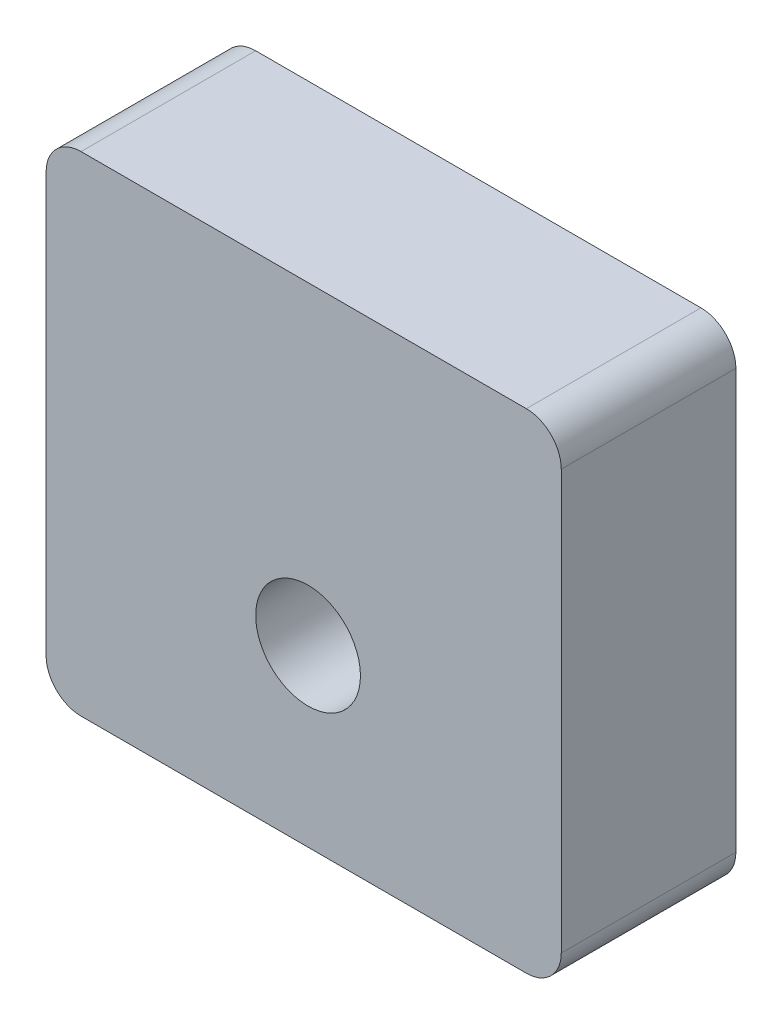
ISO-10303-21;
HEADER;
FILE_DESCRIPTION(('STEP AP214'),'2;1');
FILE_NAME('part.step','',(''),(''),'','','');
FILE_SCHEMA(('AUTOMOTIVE_DESIGN { 1 0 10303 214 1 1 1 1 }'));
ENDSEC;
DATA;
#1=APPLICATION_CONTEXT('core data for automotive mechanical design processes');
#2=APPLICATION_PROTOCOL_DEFINITION('international standard','automotive_design',2000,#1);
#3=PRODUCT_CONTEXT('',#1,'mechanical');
#4=PRODUCT('Part','Part','',(#3));
#5=PRODUCT_RELATED_PRODUCT_CATEGORY('part','',(#4));
#6=PRODUCT_DEFINITION_FORMATION('','',#4);
#7=PRODUCT_DEFINITION_CONTEXT('part definition',#1,'design');
#8=PRODUCT_DEFINITION('design','',#6,#7);
#9=PRODUCT_DEFINITION_SHAPE('','',#8);
#10=(LENGTH_UNIT() NAMED_UNIT(*) SI_UNIT(.MILLI.,.METRE.));
#11=(NAMED_UNIT(*) PLANE_ANGLE_UNIT() SI_UNIT($,.RADIAN.));
#12=(NAMED_UNIT(*) SI_UNIT($,.STERADIAN.) SOLID_ANGLE_UNIT());
#13=UNCERTAINTY_MEASURE_WITH_UNIT(LENGTH_MEASURE(1.E-05),#10,'distance_accuracy_value','');
#14=(GEOMETRIC_REPRESENTATION_CONTEXT(3) GLOBAL_UNCERTAINTY_ASSIGNED_CONTEXT((#13)) GLOBAL_UNIT_ASSIGNED_CONTEXT((#10,
#11,#12)) REPRESENTATION_CONTEXT('',''));
#15=CARTESIAN_POINT('',(0.,0.,0.));
#16=DIRECTION('',(0.,0.,1.));
#17=DIRECTION('',(1.,0.,0.));
#18=AXIS2_PLACEMENT_3D('',#15,#16,#17);
#19=CARTESIAN_POINT('',(-0.25,4.,0.));
#20=DIRECTION('',(0.,0.,1.));
#21=DIRECTION('',(1.,0.,0.));
#22=AXIS2_PLACEMENT_3D('',#19,#20,#21);
#23=PLANE('',#22);
#24=CARTESIAN_POINT('',(0.,0.,0.));
#25=DIRECTION('',(0.,0.,1.));
#26=DIRECTION('',(1.,0.,0.));
#27=AXIS2_PLACEMENT_3D('',#24,#25,#26);
#28=CIRCLE('',#27,3.);
#29=CARTESIAN_POINT('',(3.,0.,0.));
#30=VERTEX_POINT('',#29);
#31=EDGE_CURVE('E129',#30,#30,#28,.T.);
#32=ORIENTED_EDGE('',*,*,#31,.T.);
#33=EDGE_LOOP('',(#32));
#34=FACE_BOUND('',#33,.T.);
#35=DIRECTION('',(0.,1.,0.));
#36=VECTOR('',#35,1.);
#37=CARTESIAN_POINT('',(14.5,16.,0.));
#38=LINE('',#37,#36);
#39=CARTESIAN_POINT('',(14.5,-8.,0.));
#40=VERTEX_POINT('',#39);
#41=CARTESIAN_POINT('',(14.5,16.,0.));
#42=VERTEX_POINT('',#41);
#43=EDGE_CURVE('E78',#40,#42,#38,.T.);
#44=ORIENTED_EDGE('',*,*,#43,.F.);
#45=CARTESIAN_POINT('',(12.5,-8.,0.));
#46=DIRECTION('',(0.,0.,1.));
#47=DIRECTION('',(1.,0.,0.));
#48=AXIS2_PLACEMENT_3D('',#45,#46,#47);
#49=CIRCLE('',#48,2.);
#50=CARTESIAN_POINT('',(12.5,-10.,0.));
#51=VERTEX_POINT('',#50);
#52=EDGE_CURVE('E133',#51,#40,#49,.T.);
#53=ORIENTED_EDGE('',*,*,#52,.F.);
#54=DIRECTION('',(1.,0.,0.));
#55=VECTOR('',#54,1.);
#56=CARTESIAN_POINT('',(12.5,-10.,0.));
#57=LINE('',#56,#55);
#58=CARTESIAN_POINT('',(-13.,-10.,0.));
#59=VERTEX_POINT('',#58);
#60=EDGE_CURVE('E109',#59,#51,#57,.T.);
#61=ORIENTED_EDGE('',*,*,#60,.F.);
#62=CARTESIAN_POINT('',(-13.,-8.,0.));
#63=DIRECTION('',(0.,0.,1.));
#64=DIRECTION('',(1.,0.,0.));
#65=AXIS2_PLACEMENT_3D('',#62,#63,#64);
#66=CIRCLE('',#65,2.);
#67=CARTESIAN_POINT('',(-15.,-8.,0.));
#68=VERTEX_POINT('',#67);
#69=EDGE_CURVE('E136',#68,#59,#66,.T.);
#70=ORIENTED_EDGE('',*,*,#69,.F.);
#71=DIRECTION('',(0.,1.,0.));
#72=VECTOR('',#71,1.);
#73=CARTESIAN_POINT('',(-15.,-8.,0.));
#74=LINE('',#73,#72);
#75=CARTESIAN_POINT('',(-15.,16.,0.));
#76=VERTEX_POINT('',#75);
#77=EDGE_CURVE('E112',#76,#68,#74,.F.);
#78=ORIENTED_EDGE('',*,*,#77,.F.);
#79=CARTESIAN_POINT('',(-13.,16.,0.));
#80=DIRECTION('',(0.,0.,1.));
#81=DIRECTION('',(1.,0.,0.));
#82=AXIS2_PLACEMENT_3D('',#79,#80,#81);
#83=CIRCLE('',#82,2.);
#84=CARTESIAN_POINT('',(-13.,18.,0.));
#85=VERTEX_POINT('',#84);
#86=EDGE_CURVE('E94',#85,#76,#83,.T.);
#87=ORIENTED_EDGE('',*,*,#86,.F.);
#88=DIRECTION('',(1.,0.,0.));
#89=VECTOR('',#88,1.);
#90=CARTESIAN_POINT('',(-13.,18.,0.));
#91=LINE('',#90,#89);
#92=CARTESIAN_POINT('',(12.5,18.,0.));
#93=VERTEX_POINT('',#92);
#94=EDGE_CURVE('E92',#93,#85,#91,.F.);
#95=ORIENTED_EDGE('',*,*,#94,.F.);
#96=CARTESIAN_POINT('',(12.5,16.,0.));
#97=DIRECTION('',(0.,0.,1.));
#98=DIRECTION('',(1.,0.,0.));
#99=AXIS2_PLACEMENT_3D('',#96,#97,#98);
#100=CIRCLE('',#99,2.);
#101=EDGE_CURVE('E20',#42,#93,#100,.T.);
#102=ORIENTED_EDGE('',*,*,#101,.F.);
#103=EDGE_LOOP('',(#44,#53,#61,#70,#78,#87,#95,#102));
#104=FACE_BOUND('',#103,.T.);
#105=ADVANCED_FACE('F17',(#34,#104),#23,.F.);
#106=CARTESIAN_POINT('',(14.5,16.,0.));
#107=DIRECTION('',(1.,0.,0.));
#108=DIRECTION('',(0.,0.,-1.));
#109=AXIS2_PLACEMENT_3D('',#106,#107,#108);
#110=PLANE('',#109);
#111=ORIENTED_EDGE('',*,*,#43,.T.);
#112=DIRECTION('',(0.,0.,1.));
#113=VECTOR('',#112,1.);
#114=CARTESIAN_POINT('',(14.5,16.,0.));
#115=LINE('',#114,#113);
#116=CARTESIAN_POINT('',(14.5,16.,10.));
#117=VERTEX_POINT('',#116);
#118=EDGE_CURVE('E89',#117,#42,#115,.F.);
#119=ORIENTED_EDGE('',*,*,#118,.F.);
#120=DIRECTION('',(0.,1.,0.));
#121=VECTOR('',#120,1.);
#122=CARTESIAN_POINT('',(14.5,4.,10.));
#123=LINE('',#122,#121);
#124=CARTESIAN_POINT('',(14.5,-8.,10.));
#125=VERTEX_POINT('',#124);
#126=EDGE_CURVE('E128',#125,#117,#123,.T.);
#127=ORIENTED_EDGE('',*,*,#126,.F.);
#128=DIRECTION('',(0.,0.,1.));
#129=VECTOR('',#128,1.);
#130=CARTESIAN_POINT('',(14.5,-8.,0.));
#131=LINE('',#130,#129);
#132=EDGE_CURVE('E132',#40,#125,#131,.T.);
#133=ORIENTED_EDGE('',*,*,#132,.F.);
#134=EDGE_LOOP('',(#111,#119,#127,#133));
#135=FACE_BOUND('',#134,.T.);
#136=ADVANCED_FACE('F169',(#135),#110,.T.);
#137=CARTESIAN_POINT('',(12.5,16.,0.));
#138=DIRECTION('',(0.,0.,1.));
#139=DIRECTION('',(1.,0.,0.));
#140=AXIS2_PLACEMENT_3D('',#137,#138,#139);
#141=CYLINDRICAL_SURFACE('',#140,2.);
#142=ORIENTED_EDGE('',*,*,#101,.T.);
#143=DIRECTION('',(0.,0.,1.));
#144=VECTOR('',#143,1.);
#145=CARTESIAN_POINT('',(12.5,18.,0.));
#146=LINE('',#145,#144);
#147=CARTESIAN_POINT('',(12.5,18.,10.));
#148=VERTEX_POINT('',#147);
#149=EDGE_CURVE('E87',#148,#93,#146,.F.);
#150=ORIENTED_EDGE('',*,*,#149,.F.);
#151=CARTESIAN_POINT('',(12.5,16.,10.));
#152=DIRECTION('',(0.,0.,1.));
#153=DIRECTION('',(1.,0.,0.));
#154=AXIS2_PLACEMENT_3D('',#151,#152,#153);
#155=CIRCLE('',#154,2.);
#156=EDGE_CURVE('E126',#117,#148,#155,.T.);
#157=ORIENTED_EDGE('',*,*,#156,.F.);
#158=ORIENTED_EDGE('',*,*,#118,.T.);
#159=EDGE_LOOP('',(#142,#150,#157,#158));
#160=FACE_BOUND('',#159,.T.);
#161=ADVANCED_FACE('F84',(#160),#141,.T.);
#162=CARTESIAN_POINT('',(-13.,18.,0.));
#163=DIRECTION('',(0.,1.,0.));
#164=DIRECTION('',(0.,0.,1.));
#165=AXIS2_PLACEMENT_3D('',#162,#163,#164);
#166=PLANE('',#165);
#167=ORIENTED_EDGE('',*,*,#94,.T.);
#168=DIRECTION('',(0.,0.,1.));
#169=VECTOR('',#168,1.);
#170=CARTESIAN_POINT('',(-13.,18.,0.));
#171=LINE('',#170,#169);
#172=CARTESIAN_POINT('',(-13.,18.,10.));
#173=VERTEX_POINT('',#172);
#174=EDGE_CURVE('E97',#173,#85,#171,.F.);
#175=ORIENTED_EDGE('',*,*,#174,.F.);
#176=DIRECTION('',(1.,0.,0.));
#177=VECTOR('',#176,1.);
#178=CARTESIAN_POINT('',(-0.25,18.,10.));
#179=LINE('',#178,#177);
#180=EDGE_CURVE('E101',#148,#173,#179,.F.);
#181=ORIENTED_EDGE('',*,*,#180,.F.);
#182=ORIENTED_EDGE('',*,*,#149,.T.);
#183=EDGE_LOOP('',(#167,#175,#181,#182));
#184=FACE_BOUND('',#183,.T.);
#185=ADVANCED_FACE('F99',(#184),#166,.T.);
#186=CARTESIAN_POINT('',(-13.,16.,0.));
#187=DIRECTION('',(0.,0.,1.));
#188=DIRECTION('',(1.,0.,0.));
#189=AXIS2_PLACEMENT_3D('',#186,#187,#188);
#190=CYLINDRICAL_SURFACE('',#189,2.);
#191=ORIENTED_EDGE('',*,*,#86,.T.);
#192=DIRECTION('',(0.,0.,1.));
#193=VECTOR('',#192,1.);
#194=CARTESIAN_POINT('',(-15.,16.,0.));
#195=LINE('',#194,#193);
#196=CARTESIAN_POINT('',(-15.,16.,10.));
#197=VERTEX_POINT('',#196);
#198=EDGE_CURVE('E114',#197,#76,#195,.F.);
#199=ORIENTED_EDGE('',*,*,#198,.F.);
#200=CARTESIAN_POINT('',(-13.,16.,10.));
#201=DIRECTION('',(0.,0.,1.));
#202=DIRECTION('',(1.,0.,0.));
#203=AXIS2_PLACEMENT_3D('',#200,#201,#202);
#204=CIRCLE('',#203,2.);
#205=EDGE_CURVE('E123',#173,#197,#204,.T.);
#206=ORIENTED_EDGE('',*,*,#205,.F.);
#207=ORIENTED_EDGE('',*,*,#174,.T.);
#208=EDGE_LOOP('',(#191,#199,#206,#207));
#209=FACE_BOUND('',#208,.T.);
#210=ADVANCED_FACE('F140',(#209),#190,.T.);
#211=CARTESIAN_POINT('',(-15.,-8.,0.));
#212=DIRECTION('',(-1.,0.,0.));
#213=DIRECTION('',(0.,0.,1.));
#214=AXIS2_PLACEMENT_3D('',#211,#212,#213);
#215=PLANE('',#214);
#216=ORIENTED_EDGE('',*,*,#77,.T.);
#217=DIRECTION('',(0.,0.,1.));
#218=VECTOR('',#217,1.);
#219=CARTESIAN_POINT('',(-15.,-8.,0.));
#220=LINE('',#219,#218);
#221=CARTESIAN_POINT('',(-15.,-8.,10.));
#222=VERTEX_POINT('',#221);
#223=EDGE_CURVE('E113',#222,#68,#220,.F.);
#224=ORIENTED_EDGE('',*,*,#223,.F.);
#225=DIRECTION('',(0.,1.,0.));
#226=VECTOR('',#225,1.);
#227=CARTESIAN_POINT('',(-15.,4.,10.));
#228=LINE('',#227,#226);
#229=EDGE_CURVE('E122',#197,#222,#228,.F.);
#230=ORIENTED_EDGE('',*,*,#229,.F.);
#231=ORIENTED_EDGE('',*,*,#198,.T.);
#232=EDGE_LOOP('',(#216,#224,#230,#231));
#233=FACE_BOUND('',#232,.T.);
#234=ADVANCED_FACE('F164',(#233),#215,.T.);
#235=CARTESIAN_POINT('',(-13.,-8.,0.));
#236=DIRECTION('',(0.,0.,1.));
#237=DIRECTION('',(1.,0.,0.));
#238=AXIS2_PLACEMENT_3D('',#235,#236,#237);
#239=CYLINDRICAL_SURFACE('',#238,2.);
#240=ORIENTED_EDGE('',*,*,#69,.T.);
#241=DIRECTION('',(0.,0.,-1.));
#242=VECTOR('',#241,1.);
#243=CARTESIAN_POINT('',(-13.,-10.,0.));
#244=LINE('',#243,#242);
#245=CARTESIAN_POINT('',(-13.,-10.,10.));
#246=VERTEX_POINT('',#245);
#247=EDGE_CURVE('E111',#246,#59,#244,.T.);
#248=ORIENTED_EDGE('',*,*,#247,.F.);
#249=CARTESIAN_POINT('',(-13.,-8.,10.));
#250=DIRECTION('',(0.,0.,1.));
#251=DIRECTION('',(1.,0.,0.));
#252=AXIS2_PLACEMENT_3D('',#249,#250,#251);
#253=CIRCLE('',#252,2.);
#254=EDGE_CURVE('E119',#222,#246,#253,.T.);
#255=ORIENTED_EDGE('',*,*,#254,.F.);
#256=ORIENTED_EDGE('',*,*,#223,.T.);
#257=EDGE_LOOP('',(#240,#248,#255,#256));
#258=FACE_BOUND('',#257,.T.);
#259=ADVANCED_FACE('F160',(#258),#239,.T.);
#260=CARTESIAN_POINT('',(12.5,-10.,0.));
#261=DIRECTION('',(0.,-1.,0.));
#262=DIRECTION('',(0.,0.,-1.));
#263=AXIS2_PLACEMENT_3D('',#260,#261,#262);
#264=PLANE('',#263);
#265=ORIENTED_EDGE('',*,*,#60,.T.);
#266=DIRECTION('',(0.,0.,1.));
#267=VECTOR('',#266,1.);
#268=CARTESIAN_POINT('',(12.5,-10.,0.));
#269=LINE('',#268,#267);
#270=CARTESIAN_POINT('',(12.5,-10.,10.));
#271=VERTEX_POINT('',#270);
#272=EDGE_CURVE('E35',#271,#51,#269,.F.);
#273=ORIENTED_EDGE('',*,*,#272,.F.);
#274=DIRECTION('',(1.,0.,0.));
#275=VECTOR('',#274,1.);
#276=CARTESIAN_POINT('',(-0.25,-10.,10.));
#277=LINE('',#276,#275);
#278=EDGE_CURVE('E118',#246,#271,#277,.T.);
#279=ORIENTED_EDGE('',*,*,#278,.F.);
#280=ORIENTED_EDGE('',*,*,#247,.T.);
#281=EDGE_LOOP('',(#265,#273,#279,#280));
#282=FACE_BOUND('',#281,.T.);
#283=ADVANCED_FACE('F166',(#282),#264,.T.);
#284=CARTESIAN_POINT('',(12.5,-8.,0.));
#285=DIRECTION('',(0.,0.,1.));
#286=DIRECTION('',(1.,0.,0.));
#287=AXIS2_PLACEMENT_3D('',#284,#285,#286);
#288=CYLINDRICAL_SURFACE('',#287,2.);
#289=ORIENTED_EDGE('',*,*,#52,.T.);
#290=ORIENTED_EDGE('',*,*,#132,.T.);
#291=CARTESIAN_POINT('',(12.5,-8.,10.));
#292=DIRECTION('',(0.,0.,1.));
#293=DIRECTION('',(1.,0.,0.));
#294=AXIS2_PLACEMENT_3D('',#291,#292,#293);
#295=CIRCLE('',#294,2.);
#296=EDGE_CURVE('E26',#271,#125,#295,.T.);
#297=ORIENTED_EDGE('',*,*,#296,.F.);
#298=ORIENTED_EDGE('',*,*,#272,.T.);
#299=EDGE_LOOP('',(#289,#290,#297,#298));
#300=FACE_BOUND('',#299,.T.);
#301=ADVANCED_FACE('F168',(#300),#288,.T.);
#302=CARTESIAN_POINT('',(0.,0.,0.));
#303=DIRECTION('',(0.,0.,1.));
#304=DIRECTION('',(1.,0.,0.));
#305=AXIS2_PLACEMENT_3D('',#302,#303,#304);
#306=CYLINDRICAL_SURFACE('',#305,3.);
#307=ORIENTED_EDGE('',*,*,#31,.F.);
#308=EDGE_LOOP('',(#307));
#309=FACE_BOUND('',#308,.T.);
#310=CARTESIAN_POINT('',(0.,0.,10.));
#311=DIRECTION('',(0.,0.,1.));
#312=DIRECTION('',(1.,0.,0.));
#313=AXIS2_PLACEMENT_3D('',#310,#311,#312);
#314=CIRCLE('',#313,3.);
#315=CARTESIAN_POINT('',(3.,0.,10.));
#316=VERTEX_POINT('',#315);
#317=EDGE_CURVE('E11',#316,#316,#314,.F.);
#318=ORIENTED_EDGE('',*,*,#317,.F.);
#319=EDGE_LOOP('',(#318));
#320=FACE_BOUND('',#319,.T.);
#321=ADVANCED_FACE('F179',(#309,#320),#306,.F.);
#322=CARTESIAN_POINT('',(-0.25,4.,10.));
#323=DIRECTION('',(0.,0.,1.));
#324=DIRECTION('',(1.,0.,0.));
#325=AXIS2_PLACEMENT_3D('',#322,#323,#324);
#326=PLANE('',#325);
#327=ORIENTED_EDGE('',*,*,#317,.T.);
#328=EDGE_LOOP('',(#327));
#329=FACE_BOUND('',#328,.T.);
#330=ORIENTED_EDGE('',*,*,#278,.T.);
#331=ORIENTED_EDGE('',*,*,#296,.T.);
#332=ORIENTED_EDGE('',*,*,#126,.T.);
#333=ORIENTED_EDGE('',*,*,#156,.T.);
#334=ORIENTED_EDGE('',*,*,#180,.T.);
#335=ORIENTED_EDGE('',*,*,#205,.T.);
#336=ORIENTED_EDGE('',*,*,#229,.T.);
#337=ORIENTED_EDGE('',*,*,#254,.T.);
#338=EDGE_LOOP('',(#330,#331,#332,#333,#334,#335,#336,#337));
#339=FACE_BOUND('',#338,.T.);
#340=ADVANCED_FACE('F145',(#329,#339),#326,.T.);
#341=CLOSED_SHELL('',(#105,#136,#161,#185,#210,#234,#259,#283,#301,#321,#340));
#342=MANIFOLD_SOLID_BREP('B1',#341);
#343=ADVANCED_BREP_SHAPE_REPRESENTATION('',(#18,#342),#14);
#344=SHAPE_DEFINITION_REPRESENTATION(#9,#343);
ENDSEC;
END-ISO-10303-21;
